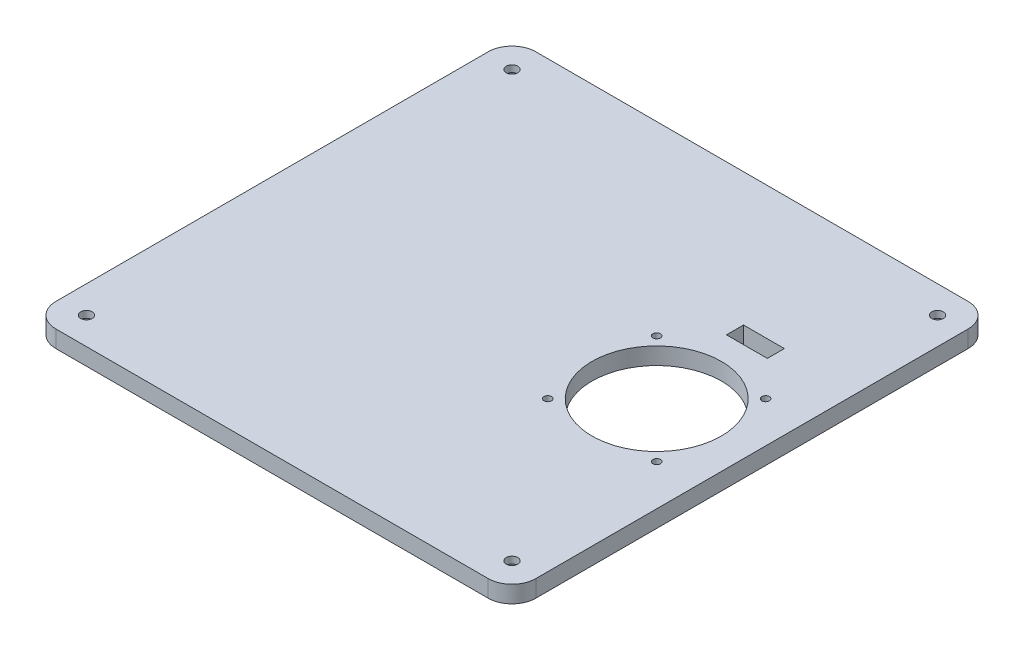
ISO-10303-21;
HEADER;
FILE_DESCRIPTION(('STEP AP214'),'2;1');
FILE_NAME('part.step','',(''),(''),'','','');
FILE_SCHEMA(('AUTOMOTIVE_DESIGN { 1 0 10303 214 1 1 1 1 }'));
ENDSEC;
DATA;
#1=APPLICATION_CONTEXT('core data for automotive mechanical design processes');
#2=APPLICATION_PROTOCOL_DEFINITION('international standard','automotive_design',2000,#1);
#3=PRODUCT_CONTEXT('',#1,'mechanical');
#4=PRODUCT('Part','Part','',(#3));
#5=PRODUCT_RELATED_PRODUCT_CATEGORY('part','',(#4));
#6=PRODUCT_DEFINITION_FORMATION('','',#4);
#7=PRODUCT_DEFINITION_CONTEXT('part definition',#1,'design');
#8=PRODUCT_DEFINITION('design','',#6,#7);
#9=PRODUCT_DEFINITION_SHAPE('','',#8);
#10=(LENGTH_UNIT() NAMED_UNIT(*) SI_UNIT(.MILLI.,.METRE.));
#11=(NAMED_UNIT(*) PLANE_ANGLE_UNIT() SI_UNIT($,.RADIAN.));
#12=(NAMED_UNIT(*) SI_UNIT($,.STERADIAN.) SOLID_ANGLE_UNIT());
#13=UNCERTAINTY_MEASURE_WITH_UNIT(LENGTH_MEASURE(1.E-05),#10,'distance_accuracy_value','');
#14=(GEOMETRIC_REPRESENTATION_CONTEXT(3) GLOBAL_UNCERTAINTY_ASSIGNED_CONTEXT((#13)) GLOBAL_UNIT_ASSIGNED_CONTEXT((#10,
#11,#12)) REPRESENTATION_CONTEXT('',''));
#15=CARTESIAN_POINT('',(0.,0.,0.));
#16=DIRECTION('',(0.,0.,1.));
#17=DIRECTION('',(1.,0.,0.));
#18=AXIS2_PLACEMENT_3D('',#15,#16,#17);
#19=CARTESIAN_POINT('',(0.,0.,0.));
#20=DIRECTION('',(0.,1.,0.));
#21=DIRECTION('',(0.,0.,1.));
#22=AXIS2_PLACEMENT_3D('',#19,#20,#21);
#23=PLANE('',#22);
#24=DIRECTION('',(1.,0.,0.));
#25=VECTOR('',#24,1.);
#26=CARTESIAN_POINT('',(48.5,0.,-31.5));
#27=LINE('',#26,#25);
#28=CARTESIAN_POINT('',(36.5,0.,-31.5));
#29=VERTEX_POINT('',#28);
#30=CARTESIAN_POINT('',(48.5,0.,-31.5));
#31=VERTEX_POINT('',#30);
#32=EDGE_CURVE('E148',#29,#31,#27,.T.);
#33=ORIENTED_EDGE('',*,*,#32,.F.);
#34=DIRECTION('',(0.,0.,-1.));
#35=VECTOR('',#34,1.);
#36=CARTESIAN_POINT('',(36.5,0.,-26.5));
#37=LINE('',#36,#35);
#38=CARTESIAN_POINT('',(36.5,0.,-26.5));
#39=VERTEX_POINT('',#38);
#40=EDGE_CURVE('E48',#39,#29,#37,.T.);
#41=ORIENTED_EDGE('',*,*,#40,.F.);
#42=DIRECTION('',(-1.,0.,0.));
#43=VECTOR('',#42,1.);
#44=CARTESIAN_POINT('',(48.5,0.,-26.5));
#45=LINE('',#44,#43);
#46=CARTESIAN_POINT('',(48.5,0.,-26.5));
#47=VERTEX_POINT('',#46);
#48=EDGE_CURVE('E139',#47,#39,#45,.T.);
#49=ORIENTED_EDGE('',*,*,#48,.F.);
#50=DIRECTION('',(0.,0.,1.));
#51=VECTOR('',#50,1.);
#52=CARTESIAN_POINT('',(48.5,0.,-26.5));
#53=LINE('',#52,#51);
#54=EDGE_CURVE('E142',#31,#47,#53,.T.);
#55=ORIENTED_EDGE('',*,*,#54,.F.);
#56=EDGE_LOOP('',(#33,#41,#49,#55));
#57=FACE_BOUND('',#56,.T.);
#58=CARTESIAN_POINT('',(42.5,0.,0.));
#59=DIRECTION('',(0.,-1.,0.));
#60=DIRECTION('',(0.,0.,-1.));
#61=AXIS2_PLACEMENT_3D('',#58,#59,#60);
#62=CIRCLE('',#61,19.);
#63=CARTESIAN_POINT('',(42.5,0.,-19.));
#64=VERTEX_POINT('',#63);
#65=EDGE_CURVE('E154',#64,#64,#62,.T.);
#66=ORIENTED_EDGE('',*,*,#65,.F.);
#67=EDGE_LOOP('',(#66));
#68=FACE_BOUND('',#67,.T.);
#69=CARTESIAN_POINT('',(-62.5,0.,62.5));
#70=DIRECTION('',(0.,-1.,0.));
#71=DIRECTION('',(0.,0.,-1.));
#72=AXIS2_PLACEMENT_3D('',#69,#70,#71);
#73=CIRCLE('',#72,3.25);
#74=CARTESIAN_POINT('',(-62.5,0.,59.25));
#75=VERTEX_POINT('',#74);
#76=EDGE_CURVE('E161',#75,#75,#73,.T.);
#77=ORIENTED_EDGE('',*,*,#76,.F.);
#78=EDGE_LOOP('',(#77));
#79=FACE_BOUND('',#78,.T.);
#80=CARTESIAN_POINT('',(-62.5,0.,-62.5));
#81=DIRECTION('',(0.,-1.,0.));
#82=DIRECTION('',(0.,0.,-1.));
#83=AXIS2_PLACEMENT_3D('',#80,#81,#82);
#84=CIRCLE('',#83,3.25);
#85=CARTESIAN_POINT('',(-62.5,0.,-65.75));
#86=VERTEX_POINT('',#85);
#87=EDGE_CURVE('E175',#86,#86,#84,.T.);
#88=ORIENTED_EDGE('',*,*,#87,.F.);
#89=EDGE_LOOP('',(#88));
#90=FACE_BOUND('',#89,.T.);
#91=CARTESIAN_POINT('',(62.5,0.,-62.5));
#92=DIRECTION('',(0.,-1.,0.));
#93=DIRECTION('',(0.,0.,-1.));
#94=AXIS2_PLACEMENT_3D('',#91,#92,#93);
#95=CIRCLE('',#94,3.25);
#96=CARTESIAN_POINT('',(62.5,0.,-65.75));
#97=VERTEX_POINT('',#96);
#98=EDGE_CURVE('E187',#97,#97,#95,.T.);
#99=ORIENTED_EDGE('',*,*,#98,.F.);
#100=EDGE_LOOP('',(#99));
#101=FACE_BOUND('',#100,.T.);
#102=CARTESIAN_POINT('',(26.5,0.,16.));
#103=DIRECTION('',(0.,1.,0.));
#104=DIRECTION('',(0.,0.,1.));
#105=AXIS2_PLACEMENT_3D('',#102,#103,#104);
#106=CIRCLE('',#105,1.1);
#107=CARTESIAN_POINT('',(26.5,0.,17.1));
#108=VERTEX_POINT('',#107);
#109=EDGE_CURVE('E223',#108,#108,#106,.F.);
#110=ORIENTED_EDGE('',*,*,#109,.F.);
#111=EDGE_LOOP('',(#110));
#112=FACE_BOUND('',#111,.T.);
#113=CARTESIAN_POINT('',(58.5,0.,16.));
#114=DIRECTION('',(0.,1.,0.));
#115=DIRECTION('',(0.,0.,1.));
#116=AXIS2_PLACEMENT_3D('',#113,#114,#115);
#117=CIRCLE('',#116,1.10000000000001);
#118=CARTESIAN_POINT('',(58.5,0.,17.1));
#119=VERTEX_POINT('',#118);
#120=EDGE_CURVE('E216',#119,#119,#117,.F.);
#121=ORIENTED_EDGE('',*,*,#120,.F.);
#122=EDGE_LOOP('',(#121));
#123=FACE_BOUND('',#122,.T.);
#124=CARTESIAN_POINT('',(58.5,0.,-16.));
#125=DIRECTION('',(0.,1.,0.));
#126=DIRECTION('',(0.,0.,1.));
#127=AXIS2_PLACEMENT_3D('',#124,#125,#126);
#128=CIRCLE('',#127,1.10000000000001);
#129=CARTESIAN_POINT('',(58.5,0.,-14.9));
#130=VERTEX_POINT('',#129);
#131=EDGE_CURVE('E215',#130,#130,#128,.F.);
#132=ORIENTED_EDGE('',*,*,#131,.F.);
#133=EDGE_LOOP('',(#132));
#134=FACE_BOUND('',#133,.T.);
#135=CARTESIAN_POINT('',(26.5,0.,-16.));
#136=DIRECTION('',(0.,1.,0.));
#137=DIRECTION('',(0.,0.,1.));
#138=AXIS2_PLACEMENT_3D('',#135,#136,#137);
#139=CIRCLE('',#138,1.1);
#140=CARTESIAN_POINT('',(26.5,0.,-14.9));
#141=VERTEX_POINT('',#140);
#142=EDGE_CURVE('E232',#141,#141,#139,.F.);
#143=ORIENTED_EDGE('',*,*,#142,.F.);
#144=EDGE_LOOP('',(#143));
#145=FACE_BOUND('',#144,.T.);
#146=DIRECTION('',(0.,0.,1.));
#147=VECTOR('',#146,1.);
#148=CARTESIAN_POINT('',(-70.5,0.,-70.5));
#149=LINE('',#148,#147);
#150=CARTESIAN_POINT('',(-70.5,0.,-63.5));
#151=VERTEX_POINT('',#150);
#152=CARTESIAN_POINT('',(-70.5,0.,63.5));
#153=VERTEX_POINT('',#152);
#154=EDGE_CURVE('E255',#151,#153,#149,.T.);
#155=ORIENTED_EDGE('',*,*,#154,.F.);
#156=CARTESIAN_POINT('',(-63.5,0.,-63.5));
#157=DIRECTION('',(0.,1.,0.));
#158=DIRECTION('',(0.,0.,1.));
#159=AXIS2_PLACEMENT_3D('',#156,#157,#158);
#160=CIRCLE('',#159,7.);
#161=CARTESIAN_POINT('',(-63.5,0.,-70.5));
#162=VERTEX_POINT('',#161);
#163=EDGE_CURVE('E270',#151,#162,#160,.F.);
#164=ORIENTED_EDGE('',*,*,#163,.T.);
#165=DIRECTION('',(-1.,0.,0.));
#166=VECTOR('',#165,1.);
#167=CARTESIAN_POINT('',(-70.5,0.,-70.5));
#168=LINE('',#167,#166);
#169=CARTESIAN_POINT('',(63.5,0.,-70.5));
#170=VERTEX_POINT('',#169);
#171=EDGE_CURVE('E252',#170,#162,#168,.T.);
#172=ORIENTED_EDGE('',*,*,#171,.F.);
#173=CARTESIAN_POINT('',(63.5,0.,-63.5));
#174=DIRECTION('',(0.,1.,0.));
#175=DIRECTION('',(0.,0.,1.));
#176=AXIS2_PLACEMENT_3D('',#173,#174,#175);
#177=CIRCLE('',#176,7.);
#178=CARTESIAN_POINT('',(70.5,0.,-63.5));
#179=VERTEX_POINT('',#178);
#180=EDGE_CURVE('E268',#170,#179,#177,.F.);
#181=ORIENTED_EDGE('',*,*,#180,.T.);
#182=DIRECTION('',(0.,0.,-1.));
#183=VECTOR('',#182,1.);
#184=CARTESIAN_POINT('',(70.5,0.,-70.5));
#185=LINE('',#184,#183);
#186=CARTESIAN_POINT('',(70.5,0.,63.5));
#187=VERTEX_POINT('',#186);
#188=EDGE_CURVE('E235',#187,#179,#185,.T.);
#189=ORIENTED_EDGE('',*,*,#188,.F.);
#190=CARTESIAN_POINT('',(63.5,0.,63.5));
#191=DIRECTION('',(0.,1.,0.));
#192=DIRECTION('',(0.,0.,1.));
#193=AXIS2_PLACEMENT_3D('',#190,#191,#192);
#194=CIRCLE('',#193,7.);
#195=CARTESIAN_POINT('',(63.5,0.,70.5));
#196=VERTEX_POINT('',#195);
#197=EDGE_CURVE('E266',#187,#196,#194,.F.);
#198=ORIENTED_EDGE('',*,*,#197,.T.);
#199=DIRECTION('',(1.,0.,0.));
#200=VECTOR('',#199,1.);
#201=CARTESIAN_POINT('',(-70.5,0.,70.5));
#202=LINE('',#201,#200);
#203=CARTESIAN_POINT('',(-63.5,0.,70.5));
#204=VERTEX_POINT('',#203);
#205=EDGE_CURVE('E240',#204,#196,#202,.T.);
#206=ORIENTED_EDGE('',*,*,#205,.F.);
#207=CARTESIAN_POINT('',(-63.5,0.,63.5));
#208=DIRECTION('',(0.,1.,0.));
#209=DIRECTION('',(0.,0.,1.));
#210=AXIS2_PLACEMENT_3D('',#207,#208,#209);
#211=CIRCLE('',#210,7.);
#212=EDGE_CURVE('E264',#204,#153,#211,.F.);
#213=ORIENTED_EDGE('',*,*,#212,.T.);
#214=EDGE_LOOP('',(#155,#164,#172,#181,#189,#198,#206,#213));
#215=FACE_BOUND('',#214,.T.);
#216=CARTESIAN_POINT('',(62.5,0.,62.5));
#217=DIRECTION('',(0.,-1.,0.));
#218=DIRECTION('',(0.,0.,-1.));
#219=AXIS2_PLACEMENT_3D('',#216,#217,#218);
#220=CIRCLE('',#219,3.25);
#221=CARTESIAN_POINT('',(62.5,0.,59.25));
#222=VERTEX_POINT('',#221);
#223=EDGE_CURVE('E199',#222,#222,#220,.T.);
#224=ORIENTED_EDGE('',*,*,#223,.F.);
#225=EDGE_LOOP('',(#224));
#226=FACE_BOUND('',#225,.T.);
#227=ADVANCED_FACE('F33',(#57,#68,#79,#90,#101,#112,#123,#134,#145,#215,#226),#23,.F.);
#228=CARTESIAN_POINT('',(70.5,5.,-70.5));
#229=DIRECTION('',(-1.,0.,0.));
#230=DIRECTION('',(0.,0.,1.));
#231=AXIS2_PLACEMENT_3D('',#228,#229,#230);
#232=PLANE('',#231);
#233=ORIENTED_EDGE('',*,*,#188,.T.);
#234=DIRECTION('',(0.,-1.,0.));
#235=VECTOR('',#234,1.);
#236=CARTESIAN_POINT('',(70.5,5.,-63.5));
#237=LINE('',#236,#235);
#238=CARTESIAN_POINT('',(70.5,5.,-63.5));
#239=VERTEX_POINT('',#238);
#240=EDGE_CURVE('E288',#179,#239,#237,.F.);
#241=ORIENTED_EDGE('',*,*,#240,.T.);
#242=DIRECTION('',(0.,0.,-1.));
#243=VECTOR('',#242,1.);
#244=CARTESIAN_POINT('',(70.5,5.,-70.5));
#245=LINE('',#244,#243);
#246=CARTESIAN_POINT('',(70.5,5.,63.5));
#247=VERTEX_POINT('',#246);
#248=EDGE_CURVE('E236',#247,#239,#245,.T.);
#249=ORIENTED_EDGE('',*,*,#248,.F.);
#250=DIRECTION('',(0.,-1.,0.));
#251=VECTOR('',#250,1.);
#252=CARTESIAN_POINT('',(70.5,5.,63.5));
#253=LINE('',#252,#251);
#254=EDGE_CURVE('E285',#247,#187,#253,.T.);
#255=ORIENTED_EDGE('',*,*,#254,.T.);
#256=EDGE_LOOP('',(#233,#241,#249,#255));
#257=FACE_BOUND('',#256,.T.);
#258=ADVANCED_FACE('F308',(#257),#232,.F.);
#259=CARTESIAN_POINT('',(-70.5,5.,-70.5));
#260=DIRECTION('',(0.,0.,1.));
#261=DIRECTION('',(1.,0.,0.));
#262=AXIS2_PLACEMENT_3D('',#259,#260,#261);
#263=PLANE('',#262);
#264=ORIENTED_EDGE('',*,*,#171,.T.);
#265=DIRECTION('',(0.,-1.,0.));
#266=VECTOR('',#265,1.);
#267=CARTESIAN_POINT('',(-63.5,5.,-70.5));
#268=LINE('',#267,#266);
#269=CARTESIAN_POINT('',(-63.5,5.,-70.5));
#270=VERTEX_POINT('',#269);
#271=EDGE_CURVE('E275',#162,#270,#268,.F.);
#272=ORIENTED_EDGE('',*,*,#271,.T.);
#273=DIRECTION('',(-1.,0.,0.));
#274=VECTOR('',#273,1.);
#275=CARTESIAN_POINT('',(-70.5,5.,-70.5));
#276=LINE('',#275,#274);
#277=CARTESIAN_POINT('',(63.5,5.,-70.5));
#278=VERTEX_POINT('',#277);
#279=EDGE_CURVE('E239',#278,#270,#276,.T.);
#280=ORIENTED_EDGE('',*,*,#279,.F.);
#281=DIRECTION('',(0.,-1.,0.));
#282=VECTOR('',#281,1.);
#283=CARTESIAN_POINT('',(63.5,5.,-70.5));
#284=LINE('',#283,#282);
#285=EDGE_CURVE('E272',#278,#170,#284,.T.);
#286=ORIENTED_EDGE('',*,*,#285,.T.);
#287=EDGE_LOOP('',(#264,#272,#280,#286));
#288=FACE_BOUND('',#287,.T.);
#289=ADVANCED_FACE('F318',(#288),#263,.F.);
#290=CARTESIAN_POINT('',(-70.5,5.,-70.5));
#291=DIRECTION('',(1.,0.,0.));
#292=DIRECTION('',(0.,0.,-1.));
#293=AXIS2_PLACEMENT_3D('',#290,#291,#292);
#294=PLANE('',#293);
#295=DIRECTION('',(0.,0.,1.));
#296=VECTOR('',#295,1.);
#297=CARTESIAN_POINT('',(-70.5,5.,-70.5));
#298=LINE('',#297,#296);
#299=CARTESIAN_POINT('',(-70.5,5.,-63.5));
#300=VERTEX_POINT('',#299);
#301=CARTESIAN_POINT('',(-70.5,5.,63.5));
#302=VERTEX_POINT('',#301);
#303=EDGE_CURVE('E243',#300,#302,#298,.T.);
#304=ORIENTED_EDGE('',*,*,#303,.F.);
#305=DIRECTION('',(0.,-1.,0.));
#306=VECTOR('',#305,1.);
#307=CARTESIAN_POINT('',(-70.5,5.,-63.5));
#308=LINE('',#307,#306);
#309=EDGE_CURVE('E261',#300,#151,#308,.T.);
#310=ORIENTED_EDGE('',*,*,#309,.T.);
#311=ORIENTED_EDGE('',*,*,#154,.T.);
#312=DIRECTION('',(0.,-1.,0.));
#313=VECTOR('',#312,1.);
#314=CARTESIAN_POINT('',(-70.5,5.,63.5));
#315=LINE('',#314,#313);
#316=EDGE_CURVE('E249',#153,#302,#315,.F.);
#317=ORIENTED_EDGE('',*,*,#316,.T.);
#318=EDGE_LOOP('',(#304,#310,#311,#317));
#319=FACE_BOUND('',#318,.T.);
#320=ADVANCED_FACE('F326',(#319),#294,.F.);
#321=CARTESIAN_POINT('',(-70.5,5.,70.5));
#322=DIRECTION('',(0.,0.,-1.));
#323=DIRECTION('',(-1.,0.,0.));
#324=AXIS2_PLACEMENT_3D('',#321,#322,#323);
#325=PLANE('',#324);
#326=ORIENTED_EDGE('',*,*,#205,.T.);
#327=DIRECTION('',(0.,-1.,0.));
#328=VECTOR('',#327,1.);
#329=CARTESIAN_POINT('',(63.5,5.,70.5));
#330=LINE('',#329,#328);
#331=CARTESIAN_POINT('',(63.5,5.,70.5));
#332=VERTEX_POINT('',#331);
#333=EDGE_CURVE('E11',#196,#332,#330,.F.);
#334=ORIENTED_EDGE('',*,*,#333,.T.);
#335=DIRECTION('',(1.,0.,0.));
#336=VECTOR('',#335,1.);
#337=CARTESIAN_POINT('',(-70.5,5.,70.5));
#338=LINE('',#337,#336);
#339=CARTESIAN_POINT('',(-63.5,5.,70.5));
#340=VERTEX_POINT('',#339);
#341=EDGE_CURVE('E246',#340,#332,#338,.T.);
#342=ORIENTED_EDGE('',*,*,#341,.F.);
#343=DIRECTION('',(0.,-1.,0.));
#344=VECTOR('',#343,1.);
#345=CARTESIAN_POINT('',(-63.5,5.,70.5));
#346=LINE('',#345,#344);
#347=EDGE_CURVE('E41',#340,#204,#346,.T.);
#348=ORIENTED_EDGE('',*,*,#347,.T.);
#349=EDGE_LOOP('',(#326,#334,#342,#348));
#350=FACE_BOUND('',#349,.T.);
#351=ADVANCED_FACE('F294',(#350),#325,.F.);
#352=CARTESIAN_POINT('',(0.,5.,0.));
#353=DIRECTION('',(0.,1.,0.));
#354=DIRECTION('',(0.,0.,1.));
#355=AXIS2_PLACEMENT_3D('',#352,#353,#354);
#356=PLANE('',#355);
#357=DIRECTION('',(0.,0.,-1.));
#358=VECTOR('',#357,1.);
#359=CARTESIAN_POINT('',(36.5,5.,-26.5));
#360=LINE('',#359,#358);
#361=CARTESIAN_POINT('',(36.5,5.,-26.5));
#362=VERTEX_POINT('',#361);
#363=CARTESIAN_POINT('',(36.5,5.,-31.5));
#364=VERTEX_POINT('',#363);
#365=EDGE_CURVE('E123',#362,#364,#360,.T.);
#366=ORIENTED_EDGE('',*,*,#365,.T.);
#367=DIRECTION('',(1.,0.,0.));
#368=VECTOR('',#367,1.);
#369=CARTESIAN_POINT('',(48.5,5.,-31.5));
#370=LINE('',#369,#368);
#371=CARTESIAN_POINT('',(48.5,5.,-31.5));
#372=VERTEX_POINT('',#371);
#373=EDGE_CURVE('E132',#364,#372,#370,.T.);
#374=ORIENTED_EDGE('',*,*,#373,.T.);
#375=DIRECTION('',(0.,0.,1.));
#376=VECTOR('',#375,1.);
#377=CARTESIAN_POINT('',(48.5,5.,-26.5));
#378=LINE('',#377,#376);
#379=CARTESIAN_POINT('',(48.5,5.,-26.5));
#380=VERTEX_POINT('',#379);
#381=EDGE_CURVE('E56',#372,#380,#378,.T.);
#382=ORIENTED_EDGE('',*,*,#381,.T.);
#383=DIRECTION('',(-1.,0.,0.));
#384=VECTOR('',#383,1.);
#385=CARTESIAN_POINT('',(48.5,5.,-26.5));
#386=LINE('',#385,#384);
#387=EDGE_CURVE('E129',#380,#362,#386,.T.);
#388=ORIENTED_EDGE('',*,*,#387,.T.);
#389=EDGE_LOOP('',(#366,#374,#382,#388));
#390=FACE_BOUND('',#389,.T.);
#391=CARTESIAN_POINT('',(42.5,5.,0.));
#392=DIRECTION('',(0.,-1.,0.));
#393=DIRECTION('',(0.,0.,-1.));
#394=AXIS2_PLACEMENT_3D('',#391,#392,#393);
#395=CIRCLE('',#394,19.);
#396=CARTESIAN_POINT('',(42.5,5.,-19.));
#397=VERTEX_POINT('',#396);
#398=EDGE_CURVE('E158',#397,#397,#395,.T.);
#399=ORIENTED_EDGE('',*,*,#398,.T.);
#400=EDGE_LOOP('',(#399));
#401=FACE_BOUND('',#400,.T.);
#402=CARTESIAN_POINT('',(-62.5,5.,62.5));
#403=DIRECTION('',(0.,-1.,0.));
#404=DIRECTION('',(0.,0.,-1.));
#405=AXIS2_PLACEMENT_3D('',#402,#403,#404);
#406=CIRCLE('',#405,1.7);
#407=CARTESIAN_POINT('',(-62.5,5.,60.8));
#408=VERTEX_POINT('',#407);
#409=EDGE_CURVE('E172',#408,#408,#406,.T.);
#410=ORIENTED_EDGE('',*,*,#409,.T.);
#411=EDGE_LOOP('',(#410));
#412=FACE_BOUND('',#411,.T.);
#413=CARTESIAN_POINT('',(-62.5,5.,-62.5));
#414=DIRECTION('',(0.,-1.,0.));
#415=DIRECTION('',(0.,0.,-1.));
#416=AXIS2_PLACEMENT_3D('',#413,#414,#415);
#417=CIRCLE('',#416,1.7);
#418=CARTESIAN_POINT('',(-62.5,5.,-64.2));
#419=VERTEX_POINT('',#418);
#420=EDGE_CURVE('E184',#419,#419,#417,.T.);
#421=ORIENTED_EDGE('',*,*,#420,.T.);
#422=EDGE_LOOP('',(#421));
#423=FACE_BOUND('',#422,.T.);
#424=CARTESIAN_POINT('',(62.5,5.,-62.5));
#425=DIRECTION('',(0.,-1.,0.));
#426=DIRECTION('',(0.,0.,-1.));
#427=AXIS2_PLACEMENT_3D('',#424,#425,#426);
#428=CIRCLE('',#427,1.70000000000001);
#429=CARTESIAN_POINT('',(62.5,5.,-64.2));
#430=VERTEX_POINT('',#429);
#431=EDGE_CURVE('E196',#430,#430,#428,.T.);
#432=ORIENTED_EDGE('',*,*,#431,.T.);
#433=EDGE_LOOP('',(#432));
#434=FACE_BOUND('',#433,.T.);
#435=CARTESIAN_POINT('',(62.5,5.,62.5));
#436=DIRECTION('',(0.,-1.,0.));
#437=DIRECTION('',(0.,0.,-1.));
#438=AXIS2_PLACEMENT_3D('',#435,#436,#437);
#439=CIRCLE('',#438,1.70000000000001);
#440=CARTESIAN_POINT('',(62.5,5.,60.8));
#441=VERTEX_POINT('',#440);
#442=EDGE_CURVE('E208',#441,#441,#439,.T.);
#443=ORIENTED_EDGE('',*,*,#442,.T.);
#444=EDGE_LOOP('',(#443));
#445=FACE_BOUND('',#444,.T.);
#446=CARTESIAN_POINT('',(26.5,5.,16.));
#447=DIRECTION('',(0.,1.,0.));
#448=DIRECTION('',(0.,0.,1.));
#449=AXIS2_PLACEMENT_3D('',#446,#447,#448);
#450=CIRCLE('',#449,1.1);
#451=CARTESIAN_POINT('',(26.5,5.,17.1));
#452=VERTEX_POINT('',#451);
#453=EDGE_CURVE('E211',#452,#452,#450,.T.);
#454=ORIENTED_EDGE('',*,*,#453,.F.);
#455=EDGE_LOOP('',(#454));
#456=FACE_BOUND('',#455,.T.);
#457=CARTESIAN_POINT('',(58.5,5.,16.));
#458=DIRECTION('',(0.,1.,0.));
#459=DIRECTION('',(0.,0.,1.));
#460=AXIS2_PLACEMENT_3D('',#457,#458,#459);
#461=CIRCLE('',#460,1.10000000000001);
#462=CARTESIAN_POINT('',(58.5,5.,17.1));
#463=VERTEX_POINT('',#462);
#464=EDGE_CURVE('E220',#463,#463,#461,.T.);
#465=ORIENTED_EDGE('',*,*,#464,.F.);
#466=EDGE_LOOP('',(#465));
#467=FACE_BOUND('',#466,.T.);
#468=CARTESIAN_POINT('',(58.5,5.,-16.));
#469=DIRECTION('',(0.,1.,0.));
#470=DIRECTION('',(0.,0.,1.));
#471=AXIS2_PLACEMENT_3D('',#468,#469,#470);
#472=CIRCLE('',#471,1.10000000000001);
#473=CARTESIAN_POINT('',(58.5,5.,-14.9));
#474=VERTEX_POINT('',#473);
#475=EDGE_CURVE('E212',#474,#474,#472,.T.);
#476=ORIENTED_EDGE('',*,*,#475,.F.);
#477=EDGE_LOOP('',(#476));
#478=FACE_BOUND('',#477,.T.);
#479=CARTESIAN_POINT('',(26.5,5.,-16.));
#480=DIRECTION('',(0.,1.,0.));
#481=DIRECTION('',(0.,0.,1.));
#482=AXIS2_PLACEMENT_3D('',#479,#480,#481);
#483=CIRCLE('',#482,1.1);
#484=CARTESIAN_POINT('',(26.5,5.,-14.9));
#485=VERTEX_POINT('',#484);
#486=EDGE_CURVE('E219',#485,#485,#483,.T.);
#487=ORIENTED_EDGE('',*,*,#486,.F.);
#488=EDGE_LOOP('',(#487));
#489=FACE_BOUND('',#488,.T.);
#490=ORIENTED_EDGE('',*,*,#279,.T.);
#491=CARTESIAN_POINT('',(-63.5,5.,-63.5));
#492=DIRECTION('',(0.,1.,0.));
#493=DIRECTION('',(0.,0.,1.));
#494=AXIS2_PLACEMENT_3D('',#491,#492,#493);
#495=CIRCLE('',#494,7.);
#496=EDGE_CURVE('E283',#270,#300,#495,.T.);
#497=ORIENTED_EDGE('',*,*,#496,.T.);
#498=ORIENTED_EDGE('',*,*,#303,.T.);
#499=CARTESIAN_POINT('',(-63.5,5.,63.5));
#500=DIRECTION('',(0.,1.,0.));
#501=DIRECTION('',(0.,0.,1.));
#502=AXIS2_PLACEMENT_3D('',#499,#500,#501);
#503=CIRCLE('',#502,7.);
#504=EDGE_CURVE('E277',#302,#340,#503,.T.);
#505=ORIENTED_EDGE('',*,*,#504,.T.);
#506=ORIENTED_EDGE('',*,*,#341,.T.);
#507=CARTESIAN_POINT('',(63.5,5.,63.5));
#508=DIRECTION('',(0.,1.,0.));
#509=DIRECTION('',(0.,0.,1.));
#510=AXIS2_PLACEMENT_3D('',#507,#508,#509);
#511=CIRCLE('',#510,7.);
#512=EDGE_CURVE('E279',#332,#247,#511,.T.);
#513=ORIENTED_EDGE('',*,*,#512,.T.);
#514=ORIENTED_EDGE('',*,*,#248,.T.);
#515=CARTESIAN_POINT('',(63.5,5.,-63.5));
#516=DIRECTION('',(0.,1.,0.));
#517=DIRECTION('',(0.,0.,1.));
#518=AXIS2_PLACEMENT_3D('',#515,#516,#517);
#519=CIRCLE('',#518,7.);
#520=EDGE_CURVE('E281',#239,#278,#519,.T.);
#521=ORIENTED_EDGE('',*,*,#520,.T.);
#522=EDGE_LOOP('',(#490,#497,#498,#505,#506,#513,#514,#521));
#523=FACE_BOUND('',#522,.T.);
#524=ADVANCED_FACE('F136',(#390,#401,#412,#423,#434,#445,#456,#467,#478,#489,#523),#356,.T.);
#525=CARTESIAN_POINT('',(26.5,-0.00100000000000013,-16.));
#526=DIRECTION('',(0.,1.,0.));
#527=DIRECTION('',(0.,0.,1.));
#528=AXIS2_PLACEMENT_3D('',#525,#526,#527);
#529=CYLINDRICAL_SURFACE('',#528,1.1);
#530=ORIENTED_EDGE('',*,*,#486,.T.);
#531=EDGE_LOOP('',(#530));
#532=FACE_BOUND('',#531,.T.);
#533=ORIENTED_EDGE('',*,*,#142,.T.);
#534=EDGE_LOOP('',(#533));
#535=FACE_BOUND('',#534,.T.);
#536=ADVANCED_FACE('F393',(#532,#535),#529,.F.);
#537=CARTESIAN_POINT('',(58.5,-0.00100000000000013,-16.));
#538=DIRECTION('',(0.,1.,0.));
#539=DIRECTION('',(0.,0.,1.));
#540=AXIS2_PLACEMENT_3D('',#537,#538,#539);
#541=CYLINDRICAL_SURFACE('',#540,1.10000000000001);
#542=ORIENTED_EDGE('',*,*,#475,.T.);
#543=EDGE_LOOP('',(#542));
#544=FACE_BOUND('',#543,.T.);
#545=ORIENTED_EDGE('',*,*,#131,.T.);
#546=EDGE_LOOP('',(#545));
#547=FACE_BOUND('',#546,.T.);
#548=ADVANCED_FACE('F480',(#544,#547),#541,.F.);
#549=CARTESIAN_POINT('',(58.5,-0.00100000000000013,16.));
#550=DIRECTION('',(0.,1.,0.));
#551=DIRECTION('',(0.,0.,1.));
#552=AXIS2_PLACEMENT_3D('',#549,#550,#551);
#553=CYLINDRICAL_SURFACE('',#552,1.10000000000001);
#554=ORIENTED_EDGE('',*,*,#464,.T.);
#555=EDGE_LOOP('',(#554));
#556=FACE_BOUND('',#555,.T.);
#557=ORIENTED_EDGE('',*,*,#120,.T.);
#558=EDGE_LOOP('',(#557));
#559=FACE_BOUND('',#558,.T.);
#560=ADVANCED_FACE('F483',(#556,#559),#553,.F.);
#561=CARTESIAN_POINT('',(26.5,-0.00100000000000013,16.));
#562=DIRECTION('',(0.,1.,0.));
#563=DIRECTION('',(0.,0.,1.));
#564=AXIS2_PLACEMENT_3D('',#561,#562,#563);
#565=CYLINDRICAL_SURFACE('',#564,1.1);
#566=ORIENTED_EDGE('',*,*,#453,.T.);
#567=EDGE_LOOP('',(#566));
#568=FACE_BOUND('',#567,.T.);
#569=ORIENTED_EDGE('',*,*,#109,.T.);
#570=EDGE_LOOP('',(#569));
#571=FACE_BOUND('',#570,.T.);
#572=ADVANCED_FACE('F478',(#568,#571),#565,.F.);
#573=CARTESIAN_POINT('',(62.5,0.,62.5));
#574=DIRECTION('',(0.,-1.,0.));
#575=DIRECTION('',(0.,0.,-1.));
#576=AXIS2_PLACEMENT_3D('',#573,#574,#575);
#577=CYLINDRICAL_SURFACE('',#576,1.70000000000001);
#578=ORIENTED_EDGE('',*,*,#442,.F.);
#579=EDGE_LOOP('',(#578));
#580=FACE_BOUND('',#579,.T.);
#581=CARTESIAN_POINT('',(62.5,3.,62.5));
#582=DIRECTION('',(0.,-1.,0.));
#583=DIRECTION('',(0.,0.,-1.));
#584=AXIS2_PLACEMENT_3D('',#581,#582,#583);
#585=CIRCLE('',#584,1.70000000000001);
#586=CARTESIAN_POINT('',(62.5,3.,60.8));
#587=VERTEX_POINT('',#586);
#588=EDGE_CURVE('E205',#587,#587,#585,.T.);
#589=ORIENTED_EDGE('',*,*,#588,.T.);
#590=EDGE_LOOP('',(#589));
#591=FACE_BOUND('',#590,.T.);
#592=ADVANCED_FACE('F474',(#580,#591),#577,.F.);
#593=CARTESIAN_POINT('',(64.2,3.,62.5));
#594=DIRECTION('',(0.,1.,0.));
#595=DIRECTION('',(0.,0.,1.));
#596=AXIS2_PLACEMENT_3D('',#593,#594,#595);
#597=PLANE('',#596);
#598=ORIENTED_EDGE('',*,*,#588,.F.);
#599=EDGE_LOOP('',(#598));
#600=FACE_BOUND('',#599,.T.);
#601=CARTESIAN_POINT('',(62.5,3.,62.5));
#602=DIRECTION('',(0.,-1.,0.));
#603=DIRECTION('',(0.,0.,-1.));
#604=AXIS2_PLACEMENT_3D('',#601,#602,#603);
#605=CIRCLE('',#604,3.25);
#606=CARTESIAN_POINT('',(62.5,3.,59.25));
#607=VERTEX_POINT('',#606);
#608=EDGE_CURVE('E202',#607,#607,#605,.T.);
#609=ORIENTED_EDGE('',*,*,#608,.T.);
#610=EDGE_LOOP('',(#609));
#611=FACE_BOUND('',#610,.T.);
#612=ADVANCED_FACE('F470',(#600,#611),#597,.F.);
#613=CARTESIAN_POINT('',(62.5,0.,62.5));
#614=DIRECTION('',(0.,-1.,0.));
#615=DIRECTION('',(0.,0.,-1.));
#616=AXIS2_PLACEMENT_3D('',#613,#614,#615);
#617=CYLINDRICAL_SURFACE('',#616,3.25);
#618=ORIENTED_EDGE('',*,*,#608,.F.);
#619=EDGE_LOOP('',(#618));
#620=FACE_BOUND('',#619,.T.);
#621=ORIENTED_EDGE('',*,*,#223,.T.);
#622=EDGE_LOOP('',(#621));
#623=FACE_BOUND('',#622,.T.);
#624=ADVANCED_FACE('F466',(#620,#623),#617,.F.);
#625=CARTESIAN_POINT('',(62.5,0.,-62.5));
#626=DIRECTION('',(0.,-1.,0.));
#627=DIRECTION('',(0.,0.,-1.));
#628=AXIS2_PLACEMENT_3D('',#625,#626,#627);
#629=CYLINDRICAL_SURFACE('',#628,1.70000000000001);
#630=ORIENTED_EDGE('',*,*,#431,.F.);
#631=EDGE_LOOP('',(#630));
#632=FACE_BOUND('',#631,.T.);
#633=CARTESIAN_POINT('',(62.5,3.,-62.5));
#634=DIRECTION('',(0.,-1.,0.));
#635=DIRECTION('',(0.,0.,-1.));
#636=AXIS2_PLACEMENT_3D('',#633,#634,#635);
#637=CIRCLE('',#636,1.70000000000001);
#638=CARTESIAN_POINT('',(62.5,3.,-64.2));
#639=VERTEX_POINT('',#638);
#640=EDGE_CURVE('E193',#639,#639,#637,.T.);
#641=ORIENTED_EDGE('',*,*,#640,.T.);
#642=EDGE_LOOP('',(#641));
#643=FACE_BOUND('',#642,.T.);
#644=ADVANCED_FACE('F462',(#632,#643),#629,.F.);
#645=CARTESIAN_POINT('',(64.2,3.,-62.5));
#646=DIRECTION('',(0.,1.,0.));
#647=DIRECTION('',(0.,0.,1.));
#648=AXIS2_PLACEMENT_3D('',#645,#646,#647);
#649=PLANE('',#648);
#650=ORIENTED_EDGE('',*,*,#640,.F.);
#651=EDGE_LOOP('',(#650));
#652=FACE_BOUND('',#651,.T.);
#653=CARTESIAN_POINT('',(62.5,3.,-62.5));
#654=DIRECTION('',(0.,-1.,0.));
#655=DIRECTION('',(0.,0.,-1.));
#656=AXIS2_PLACEMENT_3D('',#653,#654,#655);
#657=CIRCLE('',#656,3.25);
#658=CARTESIAN_POINT('',(62.5,3.,-65.75));
#659=VERTEX_POINT('',#658);
#660=EDGE_CURVE('E190',#659,#659,#657,.T.);
#661=ORIENTED_EDGE('',*,*,#660,.T.);
#662=EDGE_LOOP('',(#661));
#663=FACE_BOUND('',#662,.T.);
#664=ADVANCED_FACE('F458',(#652,#663),#649,.F.);
#665=CARTESIAN_POINT('',(62.5,0.,-62.5));
#666=DIRECTION('',(0.,-1.,0.));
#667=DIRECTION('',(0.,0.,-1.));
#668=AXIS2_PLACEMENT_3D('',#665,#666,#667);
#669=CYLINDRICAL_SURFACE('',#668,3.25);
#670=ORIENTED_EDGE('',*,*,#660,.F.);
#671=EDGE_LOOP('',(#670));
#672=FACE_BOUND('',#671,.T.);
#673=ORIENTED_EDGE('',*,*,#98,.T.);
#674=EDGE_LOOP('',(#673));
#675=FACE_BOUND('',#674,.T.);
#676=ADVANCED_FACE('F454',(#672,#675),#669,.F.);
#677=CARTESIAN_POINT('',(-62.5,0.,-62.5));
#678=DIRECTION('',(0.,-1.,0.));
#679=DIRECTION('',(0.,0.,-1.));
#680=AXIS2_PLACEMENT_3D('',#677,#678,#679);
#681=CYLINDRICAL_SURFACE('',#680,1.7);
#682=ORIENTED_EDGE('',*,*,#420,.F.);
#683=EDGE_LOOP('',(#682));
#684=FACE_BOUND('',#683,.T.);
#685=CARTESIAN_POINT('',(-62.5,3.,-62.5));
#686=DIRECTION('',(0.,-1.,0.));
#687=DIRECTION('',(0.,0.,-1.));
#688=AXIS2_PLACEMENT_3D('',#685,#686,#687);
#689=CIRCLE('',#688,1.7);
#690=CARTESIAN_POINT('',(-62.5,3.,-64.2));
#691=VERTEX_POINT('',#690);
#692=EDGE_CURVE('E181',#691,#691,#689,.T.);
#693=ORIENTED_EDGE('',*,*,#692,.T.);
#694=EDGE_LOOP('',(#693));
#695=FACE_BOUND('',#694,.T.);
#696=ADVANCED_FACE('F450',(#684,#695),#681,.F.);
#697=CARTESIAN_POINT('',(-60.8,3.,-62.5));
#698=DIRECTION('',(0.,1.,0.));
#699=DIRECTION('',(0.,0.,1.));
#700=AXIS2_PLACEMENT_3D('',#697,#698,#699);
#701=PLANE('',#700);
#702=ORIENTED_EDGE('',*,*,#692,.F.);
#703=EDGE_LOOP('',(#702));
#704=FACE_BOUND('',#703,.T.);
#705=CARTESIAN_POINT('',(-62.5,3.,-62.5));
#706=DIRECTION('',(0.,-1.,0.));
#707=DIRECTION('',(0.,0.,-1.));
#708=AXIS2_PLACEMENT_3D('',#705,#706,#707);
#709=CIRCLE('',#708,3.25);
#710=CARTESIAN_POINT('',(-62.5,3.,-65.75));
#711=VERTEX_POINT('',#710);
#712=EDGE_CURVE('E178',#711,#711,#709,.T.);
#713=ORIENTED_EDGE('',*,*,#712,.T.);
#714=EDGE_LOOP('',(#713));
#715=FACE_BOUND('',#714,.T.);
#716=ADVANCED_FACE('F446',(#704,#715),#701,.F.);
#717=CARTESIAN_POINT('',(-62.5,0.,-62.5));
#718=DIRECTION('',(0.,-1.,0.));
#719=DIRECTION('',(0.,0.,-1.));
#720=AXIS2_PLACEMENT_3D('',#717,#718,#719);
#721=CYLINDRICAL_SURFACE('',#720,3.25);
#722=ORIENTED_EDGE('',*,*,#712,.F.);
#723=EDGE_LOOP('',(#722));
#724=FACE_BOUND('',#723,.T.);
#725=ORIENTED_EDGE('',*,*,#87,.T.);
#726=EDGE_LOOP('',(#725));
#727=FACE_BOUND('',#726,.T.);
#728=ADVANCED_FACE('F442',(#724,#727),#721,.F.);
#729=CARTESIAN_POINT('',(-62.5,0.,62.5));
#730=DIRECTION('',(0.,-1.,0.));
#731=DIRECTION('',(0.,0.,-1.));
#732=AXIS2_PLACEMENT_3D('',#729,#730,#731);
#733=CYLINDRICAL_SURFACE('',#732,1.7);
#734=ORIENTED_EDGE('',*,*,#409,.F.);
#735=EDGE_LOOP('',(#734));
#736=FACE_BOUND('',#735,.T.);
#737=CARTESIAN_POINT('',(-62.5,3.,62.5));
#738=DIRECTION('',(0.,-1.,0.));
#739=DIRECTION('',(0.,0.,-1.));
#740=AXIS2_PLACEMENT_3D('',#737,#738,#739);
#741=CIRCLE('',#740,1.7);
#742=CARTESIAN_POINT('',(-62.5,3.,60.8));
#743=VERTEX_POINT('',#742);
#744=EDGE_CURVE('E169',#743,#743,#741,.T.);
#745=ORIENTED_EDGE('',*,*,#744,.T.);
#746=EDGE_LOOP('',(#745));
#747=FACE_BOUND('',#746,.T.);
#748=ADVANCED_FACE('F438',(#736,#747),#733,.F.);
#749=CARTESIAN_POINT('',(-60.8,3.,62.5));
#750=DIRECTION('',(0.,1.,0.));
#751=DIRECTION('',(0.,0.,1.));
#752=AXIS2_PLACEMENT_3D('',#749,#750,#751);
#753=PLANE('',#752);
#754=ORIENTED_EDGE('',*,*,#744,.F.);
#755=EDGE_LOOP('',(#754));
#756=FACE_BOUND('',#755,.T.);
#757=CARTESIAN_POINT('',(-62.5,3.,62.5));
#758=DIRECTION('',(0.,-1.,0.));
#759=DIRECTION('',(0.,0.,-1.));
#760=AXIS2_PLACEMENT_3D('',#757,#758,#759);
#761=CIRCLE('',#760,3.25);
#762=CARTESIAN_POINT('',(-62.5,3.,59.25));
#763=VERTEX_POINT('',#762);
#764=EDGE_CURVE('E166',#763,#763,#761,.T.);
#765=ORIENTED_EDGE('',*,*,#764,.T.);
#766=EDGE_LOOP('',(#765));
#767=FACE_BOUND('',#766,.T.);
#768=ADVANCED_FACE('F434',(#756,#767),#753,.F.);
#769=CARTESIAN_POINT('',(-62.5,0.,62.5));
#770=DIRECTION('',(0.,-1.,0.));
#771=DIRECTION('',(0.,0.,-1.));
#772=AXIS2_PLACEMENT_3D('',#769,#770,#771);
#773=CYLINDRICAL_SURFACE('',#772,3.25);
#774=ORIENTED_EDGE('',*,*,#764,.F.);
#775=EDGE_LOOP('',(#774));
#776=FACE_BOUND('',#775,.T.);
#777=ORIENTED_EDGE('',*,*,#76,.T.);
#778=EDGE_LOOP('',(#777));
#779=FACE_BOUND('',#778,.T.);
#780=ADVANCED_FACE('F355',(#776,#779),#773,.F.);
#781=CARTESIAN_POINT('',(-63.5,5.,-63.5));
#782=DIRECTION('',(0.,-1.,0.));
#783=DIRECTION('',(0.,0.,-1.));
#784=AXIS2_PLACEMENT_3D('',#781,#782,#783);
#785=CYLINDRICAL_SURFACE('',#784,7.);
#786=ORIENTED_EDGE('',*,*,#496,.F.);
#787=ORIENTED_EDGE('',*,*,#271,.F.);
#788=ORIENTED_EDGE('',*,*,#163,.F.);
#789=ORIENTED_EDGE('',*,*,#309,.F.);
#790=EDGE_LOOP('',(#786,#787,#788,#789));
#791=FACE_BOUND('',#790,.T.);
#792=ADVANCED_FACE('F323',(#791),#785,.T.);
#793=CARTESIAN_POINT('',(63.5,5.,-63.5));
#794=DIRECTION('',(0.,-1.,0.));
#795=DIRECTION('',(0.,0.,-1.));
#796=AXIS2_PLACEMENT_3D('',#793,#794,#795);
#797=CYLINDRICAL_SURFACE('',#796,7.);
#798=ORIENTED_EDGE('',*,*,#520,.F.);
#799=ORIENTED_EDGE('',*,*,#240,.F.);
#800=ORIENTED_EDGE('',*,*,#180,.F.);
#801=ORIENTED_EDGE('',*,*,#285,.F.);
#802=EDGE_LOOP('',(#798,#799,#800,#801));
#803=FACE_BOUND('',#802,.T.);
#804=ADVANCED_FACE('F315',(#803),#797,.T.);
#805=CARTESIAN_POINT('',(63.5,5.,63.5));
#806=DIRECTION('',(0.,-1.,0.));
#807=DIRECTION('',(0.,0.,-1.));
#808=AXIS2_PLACEMENT_3D('',#805,#806,#807);
#809=CYLINDRICAL_SURFACE('',#808,7.);
#810=ORIENTED_EDGE('',*,*,#512,.F.);
#811=ORIENTED_EDGE('',*,*,#333,.F.);
#812=ORIENTED_EDGE('',*,*,#197,.F.);
#813=ORIENTED_EDGE('',*,*,#254,.F.);
#814=EDGE_LOOP('',(#810,#811,#812,#813));
#815=FACE_BOUND('',#814,.T.);
#816=ADVANCED_FACE('F305',(#815),#809,.T.);
#817=CARTESIAN_POINT('',(-63.5,5.,63.5));
#818=DIRECTION('',(0.,-1.,0.));
#819=DIRECTION('',(0.,0.,-1.));
#820=AXIS2_PLACEMENT_3D('',#817,#818,#819);
#821=CYLINDRICAL_SURFACE('',#820,7.);
#822=ORIENTED_EDGE('',*,*,#504,.F.);
#823=ORIENTED_EDGE('',*,*,#316,.F.);
#824=ORIENTED_EDGE('',*,*,#212,.F.);
#825=ORIENTED_EDGE('',*,*,#347,.F.);
#826=EDGE_LOOP('',(#822,#823,#824,#825));
#827=FACE_BOUND('',#826,.T.);
#828=ADVANCED_FACE('F35',(#827),#821,.T.);
#829=CARTESIAN_POINT('',(42.5,5.,0.));
#830=DIRECTION('',(0.,-1.,0.));
#831=DIRECTION('',(0.,0.,-1.));
#832=AXIS2_PLACEMENT_3D('',#829,#830,#831);
#833=CYLINDRICAL_SURFACE('',#832,19.);
#834=ORIENTED_EDGE('',*,*,#398,.F.);
#835=EDGE_LOOP('',(#834));
#836=FACE_BOUND('',#835,.T.);
#837=ORIENTED_EDGE('',*,*,#65,.T.);
#838=EDGE_LOOP('',(#837));
#839=FACE_BOUND('',#838,.T.);
#840=ADVANCED_FACE('F329',(#836,#839),#833,.F.);
#841=CARTESIAN_POINT('',(36.5,5.,-26.5));
#842=DIRECTION('',(-1.,0.,0.));
#843=DIRECTION('',(0.,0.,1.));
#844=AXIS2_PLACEMENT_3D('',#841,#842,#843);
#845=PLANE('',#844);
#846=ORIENTED_EDGE('',*,*,#40,.T.);
#847=DIRECTION('',(0.,-1.,0.));
#848=VECTOR('',#847,1.);
#849=CARTESIAN_POINT('',(36.5,5.,-31.5));
#850=LINE('',#849,#848);
#851=EDGE_CURVE('E119',#364,#29,#850,.T.);
#852=ORIENTED_EDGE('',*,*,#851,.F.);
#853=ORIENTED_EDGE('',*,*,#365,.F.);
#854=DIRECTION('',(0.,-1.,0.));
#855=VECTOR('',#854,1.);
#856=CARTESIAN_POINT('',(36.5,5.,-26.5));
#857=LINE('',#856,#855);
#858=EDGE_CURVE('E152',#362,#39,#857,.T.);
#859=ORIENTED_EDGE('',*,*,#858,.T.);
#860=EDGE_LOOP('',(#846,#852,#853,#859));
#861=FACE_BOUND('',#860,.T.);
#862=ADVANCED_FACE('F121',(#861),#845,.F.);
#863=CARTESIAN_POINT('',(48.5,5.,-26.5));
#864=DIRECTION('',(0.,0.,1.));
#865=DIRECTION('',(1.,0.,0.));
#866=AXIS2_PLACEMENT_3D('',#863,#864,#865);
#867=PLANE('',#866);
#868=ORIENTED_EDGE('',*,*,#48,.T.);
#869=ORIENTED_EDGE('',*,*,#858,.F.);
#870=ORIENTED_EDGE('',*,*,#387,.F.);
#871=DIRECTION('',(0.,-1.,0.));
#872=VECTOR('',#871,1.);
#873=CARTESIAN_POINT('',(48.5,5.,-26.5));
#874=LINE('',#873,#872);
#875=EDGE_CURVE('E155',#380,#47,#874,.T.);
#876=ORIENTED_EDGE('',*,*,#875,.T.);
#877=EDGE_LOOP('',(#868,#869,#870,#876));
#878=FACE_BOUND('',#877,.T.);
#879=ADVANCED_FACE('F402',(#878),#867,.F.);
#880=CARTESIAN_POINT('',(48.5,5.,-26.5));
#881=DIRECTION('',(1.,0.,0.));
#882=DIRECTION('',(0.,0.,-1.));
#883=AXIS2_PLACEMENT_3D('',#880,#881,#882);
#884=PLANE('',#883);
#885=ORIENTED_EDGE('',*,*,#54,.T.);
#886=ORIENTED_EDGE('',*,*,#875,.F.);
#887=ORIENTED_EDGE('',*,*,#381,.F.);
#888=DIRECTION('',(0.,-1.,0.));
#889=VECTOR('',#888,1.);
#890=CARTESIAN_POINT('',(48.5,5.,-31.5));
#891=LINE('',#890,#889);
#892=EDGE_CURVE('E128',#372,#31,#891,.T.);
#893=ORIENTED_EDGE('',*,*,#892,.T.);
#894=EDGE_LOOP('',(#885,#886,#887,#893));
#895=FACE_BOUND('',#894,.T.);
#896=ADVANCED_FACE('F411',(#895),#884,.F.);
#897=CARTESIAN_POINT('',(48.5,5.,-31.5));
#898=DIRECTION('',(0.,0.,-1.));
#899=DIRECTION('',(-1.,0.,0.));
#900=AXIS2_PLACEMENT_3D('',#897,#898,#899);
#901=PLANE('',#900);
#902=ORIENTED_EDGE('',*,*,#32,.T.);
#903=ORIENTED_EDGE('',*,*,#892,.F.);
#904=ORIENTED_EDGE('',*,*,#373,.F.);
#905=ORIENTED_EDGE('',*,*,#851,.T.);
#906=EDGE_LOOP('',(#902,#903,#904,#905));
#907=FACE_BOUND('',#906,.T.);
#908=ADVANCED_FACE('F133',(#907),#901,.F.);
#909=CLOSED_SHELL('',(#227,#258,#289,#320,#351,#524,#536,#548,#560,#572,#592,#612,#624,#644,
#664,#676,#696,#716,#728,#748,#768,#780,#792,#804,#816,#828,#840,#862,#879,#896,#908));
#910=MANIFOLD_SOLID_BREP('B2',#909);
#911=ADVANCED_BREP_SHAPE_REPRESENTATION('',(#18,#910),#14);
#912=SHAPE_DEFINITION_REPRESENTATION(#9,#911);
ENDSEC;
END-ISO-10303-21;
